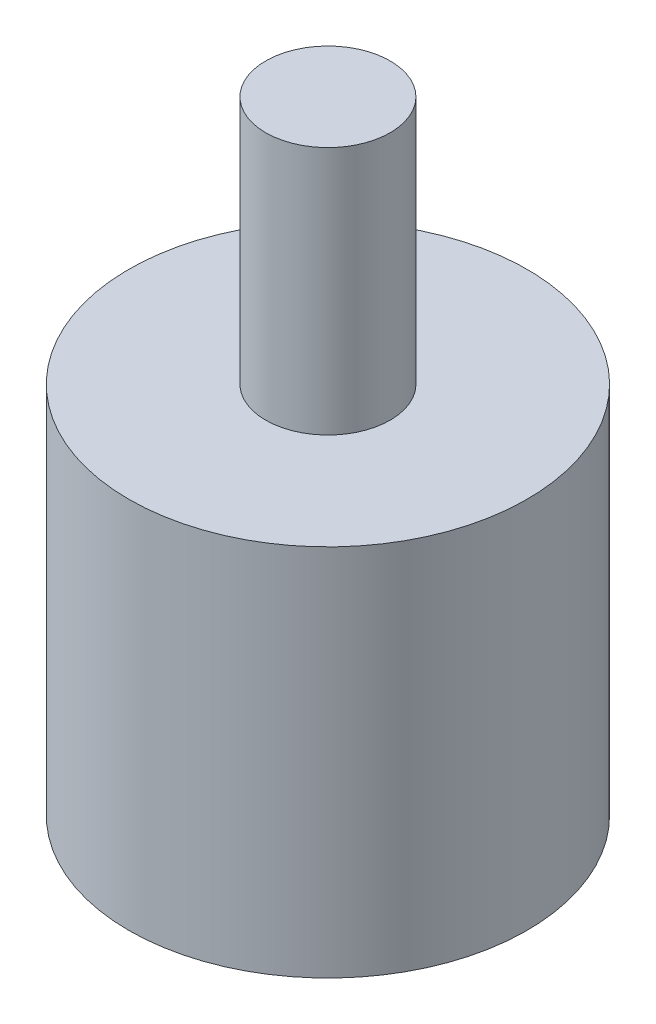
ISO-10303-21;
HEADER;
FILE_DESCRIPTION(('STEP AP214'),'2;1');
FILE_NAME('part.step','',(''),(''),'','','');
FILE_SCHEMA(('AUTOMOTIVE_DESIGN { 1 0 10303 214 1 1 1 1 }'));
ENDSEC;
DATA;
#1=APPLICATION_CONTEXT('core data for automotive mechanical design processes');
#2=APPLICATION_PROTOCOL_DEFINITION('international standard','automotive_design',2000,#1);
#3=PRODUCT_CONTEXT('',#1,'mechanical');
#4=PRODUCT('Part','Part','',(#3));
#5=PRODUCT_RELATED_PRODUCT_CATEGORY('part','',(#4));
#6=PRODUCT_DEFINITION_FORMATION('','',#4);
#7=PRODUCT_DEFINITION_CONTEXT('part definition',#1,'design');
#8=PRODUCT_DEFINITION('design','',#6,#7);
#9=PRODUCT_DEFINITION_SHAPE('','',#8);
#10=(LENGTH_UNIT() NAMED_UNIT(*) SI_UNIT(.MILLI.,.METRE.));
#11=(NAMED_UNIT(*) PLANE_ANGLE_UNIT() SI_UNIT($,.RADIAN.));
#12=(NAMED_UNIT(*) SI_UNIT($,.STERADIAN.) SOLID_ANGLE_UNIT());
#13=UNCERTAINTY_MEASURE_WITH_UNIT(LENGTH_MEASURE(1.E-05),#10,'distance_accuracy_value','');
#14=(GEOMETRIC_REPRESENTATION_CONTEXT(3) GLOBAL_UNCERTAINTY_ASSIGNED_CONTEXT((#13)) GLOBAL_UNIT_ASSIGNED_CONTEXT((#10,
#11,#12)) REPRESENTATION_CONTEXT('',''));
#15=CARTESIAN_POINT('',(0.,0.,0.));
#16=DIRECTION('',(0.,0.,1.));
#17=DIRECTION('',(1.,0.,0.));
#18=AXIS2_PLACEMENT_3D('',#15,#16,#17);
#19=CARTESIAN_POINT('',(0.,15.,0.));
#20=DIRECTION('',(0.,-1.,0.));
#21=DIRECTION('',(0.,0.,-1.));
#22=AXIS2_PLACEMENT_3D('',#19,#20,#21);
#23=CYLINDRICAL_SURFACE('',#22,8.);
#24=CARTESIAN_POINT('',(0.,15.,0.));
#25=DIRECTION('',(0.,1.,0.));
#26=DIRECTION('',(0.,0.,1.));
#27=AXIS2_PLACEMENT_3D('',#24,#25,#26);
#28=CIRCLE('',#27,8.);
#29=CARTESIAN_POINT('',(0.,15.,8.));
#30=VERTEX_POINT('',#29);
#31=EDGE_CURVE('E42',#30,#30,#28,.T.);
#32=ORIENTED_EDGE('',*,*,#31,.F.);
#33=EDGE_LOOP('',(#32));
#34=FACE_BOUND('',#33,.T.);
#35=CARTESIAN_POINT('',(0.,0.,0.));
#36=DIRECTION('',(0.,1.,0.));
#37=DIRECTION('',(0.,0.,1.));
#38=AXIS2_PLACEMENT_3D('',#35,#36,#37);
#39=CIRCLE('',#38,8.);
#40=CARTESIAN_POINT('',(0.,0.,8.));
#41=VERTEX_POINT('',#40);
#42=EDGE_CURVE('E38',#41,#41,#39,.T.);
#43=ORIENTED_EDGE('',*,*,#42,.T.);
#44=EDGE_LOOP('',(#43));
#45=FACE_BOUND('',#44,.T.);
#46=ADVANCED_FACE('F35',(#34,#45),#23,.T.);
#47=CARTESIAN_POINT('',(0.,15.,0.));
#48=DIRECTION('',(0.,1.,0.));
#49=DIRECTION('',(0.,0.,1.));
#50=AXIS2_PLACEMENT_3D('',#47,#48,#49);
#51=PLANE('',#50);
#52=CARTESIAN_POINT('',(0.,15.,0.));
#53=DIRECTION('',(0.,1.,0.));
#54=DIRECTION('',(0.,0.,1.));
#55=AXIS2_PLACEMENT_3D('',#52,#53,#54);
#56=CIRCLE('',#55,2.5);
#57=CARTESIAN_POINT('',(0.,15.,2.5));
#58=VERTEX_POINT('',#57);
#59=EDGE_CURVE('E10',#58,#58,#56,.T.);
#60=ORIENTED_EDGE('',*,*,#59,.F.);
#61=EDGE_LOOP('',(#60));
#62=FACE_BOUND('',#61,.T.);
#63=ORIENTED_EDGE('',*,*,#31,.T.);
#64=EDGE_LOOP('',(#63));
#65=FACE_BOUND('',#64,.T.);
#66=ADVANCED_FACE('F59',(#62,#65),#51,.T.);
#67=CARTESIAN_POINT('',(0.,0.,0.));
#68=DIRECTION('',(0.,1.,0.));
#69=DIRECTION('',(0.,0.,1.));
#70=AXIS2_PLACEMENT_3D('',#67,#68,#69);
#71=PLANE('',#70);
#72=ORIENTED_EDGE('',*,*,#42,.F.);
#73=EDGE_LOOP('',(#72));
#74=FACE_BOUND('',#73,.T.);
#75=ADVANCED_FACE('F56',(#74),#71,.F.);
#76=CARTESIAN_POINT('',(0.,25.,0.));
#77=DIRECTION('',(0.,-1.,0.));
#78=DIRECTION('',(0.,0.,-1.));
#79=AXIS2_PLACEMENT_3D('',#76,#77,#78);
#80=CYLINDRICAL_SURFACE('',#79,2.5);
#81=CARTESIAN_POINT('',(0.,25.,0.));
#82=DIRECTION('',(0.,1.,0.));
#83=DIRECTION('',(0.,0.,1.));
#84=AXIS2_PLACEMENT_3D('',#81,#82,#83);
#85=CIRCLE('',#84,2.5);
#86=CARTESIAN_POINT('',(0.,25.,2.5));
#87=VERTEX_POINT('',#86);
#88=EDGE_CURVE('E48',#87,#87,#85,.T.);
#89=ORIENTED_EDGE('',*,*,#88,.F.);
#90=EDGE_LOOP('',(#89));
#91=FACE_BOUND('',#90,.T.);
#92=ORIENTED_EDGE('',*,*,#59,.T.);
#93=EDGE_LOOP('',(#92));
#94=FACE_BOUND('',#93,.T.);
#95=ADVANCED_FACE('F58',(#91,#94),#80,.T.);
#96=CARTESIAN_POINT('',(0.,25.,0.));
#97=DIRECTION('',(0.,1.,0.));
#98=DIRECTION('',(0.,0.,1.));
#99=AXIS2_PLACEMENT_3D('',#96,#97,#98);
#100=PLANE('',#99);
#101=ORIENTED_EDGE('',*,*,#88,.T.);
#102=EDGE_LOOP('',(#101));
#103=FACE_BOUND('',#102,.T.);
#104=ADVANCED_FACE('F64',(#103),#100,.T.);
#105=CLOSED_SHELL('',(#46,#66,#75,#95,#104));
#106=MANIFOLD_SOLID_BREP('B2',#105);
#107=ADVANCED_BREP_SHAPE_REPRESENTATION('',(#18,#106),#14);
#108=SHAPE_DEFINITION_REPRESENTATION(#9,#107);
ENDSEC;
END-ISO-10303-21;
